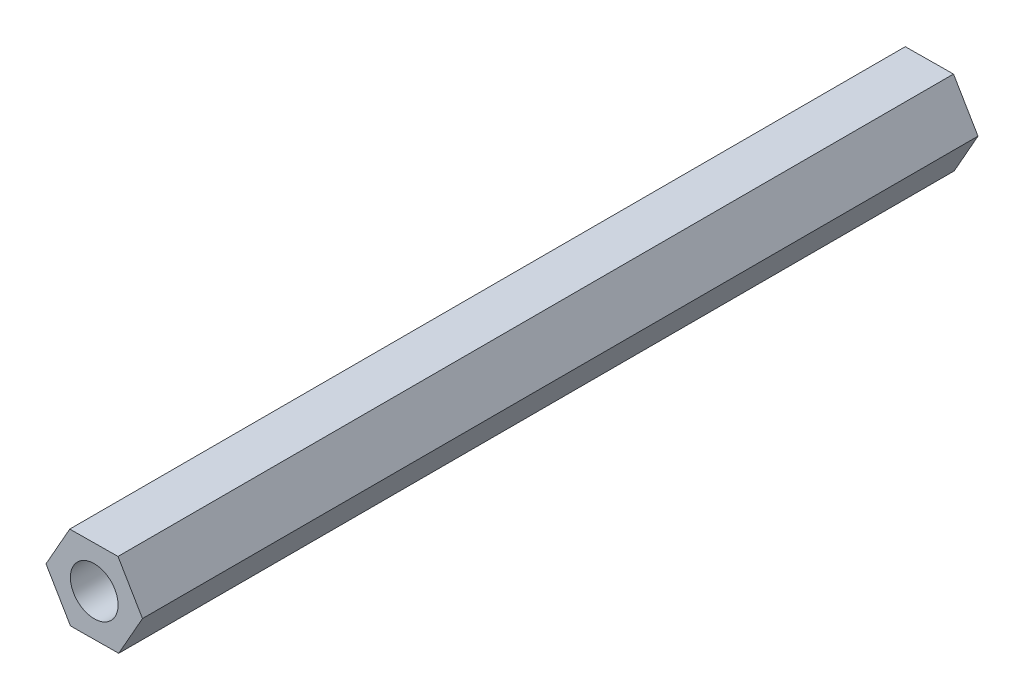
ISO-10303-21;
HEADER;
FILE_DESCRIPTION(('STEP AP214'),'2;1');
FILE_NAME('part.step','',(''),(''),'','','');
FILE_SCHEMA(('AUTOMOTIVE_DESIGN { 1 0 10303 214 1 1 1 1 }'));
ENDSEC;
DATA;
#1=APPLICATION_CONTEXT('core data for automotive mechanical design processes');
#2=APPLICATION_PROTOCOL_DEFINITION('international standard','automotive_design',2000,#1);
#3=PRODUCT_CONTEXT('',#1,'mechanical');
#4=PRODUCT('Part','Part','',(#3));
#5=PRODUCT_RELATED_PRODUCT_CATEGORY('part','',(#4));
#6=PRODUCT_DEFINITION_FORMATION('','',#4);
#7=PRODUCT_DEFINITION_CONTEXT('part definition',#1,'design');
#8=PRODUCT_DEFINITION('design','',#6,#7);
#9=PRODUCT_DEFINITION_SHAPE('','',#8);
#10=(LENGTH_UNIT() NAMED_UNIT(*) SI_UNIT(.MILLI.,.METRE.));
#11=(NAMED_UNIT(*) PLANE_ANGLE_UNIT() SI_UNIT($,.RADIAN.));
#12=(NAMED_UNIT(*) SI_UNIT($,.STERADIAN.) SOLID_ANGLE_UNIT());
#13=UNCERTAINTY_MEASURE_WITH_UNIT(LENGTH_MEASURE(1.E-05),#10,'distance_accuracy_value','');
#14=(GEOMETRIC_REPRESENTATION_CONTEXT(3) GLOBAL_UNCERTAINTY_ASSIGNED_CONTEXT((#13)) GLOBAL_UNIT_ASSIGNED_CONTEXT((#10,
#11,#12)) REPRESENTATION_CONTEXT('',''));
#15=CARTESIAN_POINT('',(0.,0.,0.));
#16=DIRECTION('',(0.,0.,1.));
#17=DIRECTION('',(1.,0.,0.));
#18=AXIS2_PLACEMENT_3D('',#15,#16,#17);
#19=CARTESIAN_POINT('',(0.,0.,70.));
#20=DIRECTION('',(0.,0.,1.));
#21=DIRECTION('',(1.,0.,0.));
#22=AXIS2_PLACEMENT_3D('',#19,#20,#21);
#23=PLANE('',#22);
#24=DIRECTION('',(0.999961257640527,0.00880245522430722,0.));
#25=VECTOR('',#24,1.);
#26=CARTESIAN_POINT('',(-1.98983906118775,-3.51765175136834,70.));
#27=LINE('',#26,#25);
#28=CARTESIAN_POINT('',(-1.98983906118775,-3.51765175136834,70.));
#29=VERTEX_POINT('',#28);
#30=CARTESIAN_POINT('',(2.05145624775792,-3.48207705211536,70.));
#31=VERTEX_POINT('',#30);
#32=EDGE_CURVE('E146',#29,#31,#27,.T.);
#33=ORIENTED_EDGE('',*,*,#32,.T.);
#34=DIRECTION('',(0.492357478980338,0.870393079529086,0.));
#35=VECTOR('',#34,1.);
#36=CARTESIAN_POINT('',(2.05145624775792,-3.48207705211536,70.));
#37=LINE('',#36,#35);
#38=CARTESIAN_POINT('',(4.04129530894568,0.0355746992529791,70.));
#39=VERTEX_POINT('',#38);
#40=EDGE_CURVE('E94',#31,#39,#37,.T.);
#41=ORIENTED_EDGE('',*,*,#40,.T.);
#42=DIRECTION('',(-0.507603778660189,0.861590624304779,0.));
#43=VECTOR('',#42,1.);
#44=CARTESIAN_POINT('',(4.04129530894568,0.0355746992529791,70.));
#45=LINE('',#44,#43);
#46=CARTESIAN_POINT('',(1.98983906118776,3.51765175136834,70.));
#47=VERTEX_POINT('',#46);
#48=EDGE_CURVE('E107',#39,#47,#45,.T.);
#49=ORIENTED_EDGE('',*,*,#48,.T.);
#50=DIRECTION('',(-0.999961257640527,-0.00880245522430723,0.));
#51=VECTOR('',#50,1.);
#52=CARTESIAN_POINT('',(1.98983906118776,3.51765175136834,70.));
#53=LINE('',#52,#51);
#54=CARTESIAN_POINT('',(-2.05145624775791,3.48207705211536,70.));
#55=VERTEX_POINT('',#54);
#56=EDGE_CURVE('E101',#47,#55,#53,.T.);
#57=ORIENTED_EDGE('',*,*,#56,.T.);
#58=DIRECTION('',(-0.492357478980338,-0.870393079529086,0.));
#59=VECTOR('',#58,1.);
#60=CARTESIAN_POINT('',(-2.05145624775791,3.48207705211536,70.));
#61=LINE('',#60,#59);
#62=CARTESIAN_POINT('',(-4.04129530894568,-0.0355746992529825,70.));
#63=VERTEX_POINT('',#62);
#64=EDGE_CURVE('E105',#55,#63,#61,.T.);
#65=ORIENTED_EDGE('',*,*,#64,.T.);
#66=DIRECTION('',(0.507603778660189,-0.861590624304779,0.));
#67=VECTOR('',#66,1.);
#68=CARTESIAN_POINT('',(-4.04129530894568,-0.0355746992529825,70.));
#69=LINE('',#68,#67);
#70=EDGE_CURVE('E57',#63,#29,#69,.T.);
#71=ORIENTED_EDGE('',*,*,#70,.T.);
#72=EDGE_LOOP('',(#33,#41,#49,#57,#65,#71));
#73=FACE_BOUND('',#72,.T.);
#74=CARTESIAN_POINT('',(0.,0.,70.));
#75=DIRECTION('',(0.,0.,1.));
#76=DIRECTION('',(1.,0.,0.));
#77=AXIS2_PLACEMENT_3D('',#74,#75,#76);
#78=CIRCLE('',#77,2.);
#79=CARTESIAN_POINT('',(2.,0.,70.));
#80=VERTEX_POINT('',#79);
#81=EDGE_CURVE('E134',#80,#80,#78,.T.);
#82=ORIENTED_EDGE('',*,*,#81,.F.);
#83=EDGE_LOOP('',(#82));
#84=FACE_BOUND('',#83,.T.);
#85=ADVANCED_FACE('F39',(#73,#84),#23,.T.);
#86=CARTESIAN_POINT('',(0.,0.,0.));
#87=DIRECTION('',(0.,0.,1.));
#88=DIRECTION('',(1.,0.,0.));
#89=AXIS2_PLACEMENT_3D('',#86,#87,#88);
#90=PLANE('',#89);
#91=DIRECTION('',(0.999961257640527,0.00880245522430722,0.));
#92=VECTOR('',#91,1.);
#93=CARTESIAN_POINT('',(-1.98983906118775,-3.51765175136834,0.));
#94=LINE('',#93,#92);
#95=CARTESIAN_POINT('',(-1.98983906118775,-3.51765175136834,0.));
#96=VERTEX_POINT('',#95);
#97=CARTESIAN_POINT('',(2.05145624775792,-3.48207705211536,0.));
#98=VERTEX_POINT('',#97);
#99=EDGE_CURVE('E129',#96,#98,#94,.T.);
#100=ORIENTED_EDGE('',*,*,#99,.F.);
#101=DIRECTION('',(0.507603778660189,-0.861590624304779,0.));
#102=VECTOR('',#101,1.);
#103=CARTESIAN_POINT('',(-4.04129530894568,-0.0355746992529825,0.));
#104=LINE('',#103,#102);
#105=CARTESIAN_POINT('',(-4.04129530894568,-0.0355746992529825,0.));
#106=VERTEX_POINT('',#105);
#107=EDGE_CURVE('E86',#106,#96,#104,.T.);
#108=ORIENTED_EDGE('',*,*,#107,.F.);
#109=DIRECTION('',(-0.492357478980338,-0.870393079529086,0.));
#110=VECTOR('',#109,1.);
#111=CARTESIAN_POINT('',(-2.05145624775791,3.48207705211536,0.));
#112=LINE('',#111,#110);
#113=CARTESIAN_POINT('',(-2.05145624775791,3.48207705211536,0.));
#114=VERTEX_POINT('',#113);
#115=EDGE_CURVE('E80',#114,#106,#112,.T.);
#116=ORIENTED_EDGE('',*,*,#115,.F.);
#117=DIRECTION('',(-0.999961257640527,-0.00880245522430723,0.));
#118=VECTOR('',#117,1.);
#119=CARTESIAN_POINT('',(1.98983906118776,3.51765175136834,0.));
#120=LINE('',#119,#118);
#121=CARTESIAN_POINT('',(1.98983906118776,3.51765175136834,0.));
#122=VERTEX_POINT('',#121);
#123=EDGE_CURVE('E116',#122,#114,#120,.T.);
#124=ORIENTED_EDGE('',*,*,#123,.F.);
#125=DIRECTION('',(-0.507603778660189,0.861590624304779,0.));
#126=VECTOR('',#125,1.);
#127=CARTESIAN_POINT('',(4.04129530894568,0.0355746992529791,0.));
#128=LINE('',#127,#126);
#129=CARTESIAN_POINT('',(4.04129530894568,0.0355746992529791,0.));
#130=VERTEX_POINT('',#129);
#131=EDGE_CURVE('E137',#130,#122,#128,.T.);
#132=ORIENTED_EDGE('',*,*,#131,.F.);
#133=DIRECTION('',(0.492357478980338,0.870393079529086,0.));
#134=VECTOR('',#133,1.);
#135=CARTESIAN_POINT('',(2.05145624775792,-3.48207705211536,0.));
#136=LINE('',#135,#134);
#137=EDGE_CURVE('E133',#98,#130,#136,.T.);
#138=ORIENTED_EDGE('',*,*,#137,.F.);
#139=EDGE_LOOP('',(#100,#108,#116,#124,#132,#138));
#140=FACE_BOUND('',#139,.T.);
#141=CARTESIAN_POINT('',(0.,0.,0.));
#142=DIRECTION('',(0.,0.,1.));
#143=DIRECTION('',(1.,0.,0.));
#144=AXIS2_PLACEMENT_3D('',#141,#142,#143);
#145=CIRCLE('',#144,2.);
#146=CARTESIAN_POINT('',(2.,0.,0.));
#147=VERTEX_POINT('',#146);
#148=EDGE_CURVE('E243',#147,#147,#145,.T.);
#149=ORIENTED_EDGE('',*,*,#148,.T.);
#150=EDGE_LOOP('',(#149));
#151=FACE_BOUND('',#150,.T.);
#152=ADVANCED_FACE('F159',(#140,#151),#90,.F.);
#153=CARTESIAN_POINT('',(-1.98983906118775,-3.51765175136834,70.));
#154=DIRECTION('',(-0.00880245522430722,0.999961257640527,0.));
#155=DIRECTION('',(-0.999961257640527,-0.00880245522430722,0.));
#156=AXIS2_PLACEMENT_3D('',#153,#154,#155);
#157=PLANE('',#156);
#158=ORIENTED_EDGE('',*,*,#99,.T.);
#159=DIRECTION('',(0.,0.,-1.));
#160=VECTOR('',#159,1.);
#161=CARTESIAN_POINT('',(2.05145624775792,-3.48207705211536,70.));
#162=LINE('',#161,#160);
#163=EDGE_CURVE('E11',#31,#98,#162,.T.);
#164=ORIENTED_EDGE('',*,*,#163,.F.);
#165=ORIENTED_EDGE('',*,*,#32,.F.);
#166=DIRECTION('',(0.,0.,-1.));
#167=VECTOR('',#166,1.);
#168=CARTESIAN_POINT('',(-1.98983906118775,-3.51765175136834,70.));
#169=LINE('',#168,#167);
#170=EDGE_CURVE('E125',#29,#96,#169,.T.);
#171=ORIENTED_EDGE('',*,*,#170,.T.);
#172=EDGE_LOOP('',(#158,#164,#165,#171));
#173=FACE_BOUND('',#172,.T.);
#174=ADVANCED_FACE('F41',(#173),#157,.F.);
#175=CARTESIAN_POINT('',(2.05145624775792,-3.48207705211536,70.));
#176=DIRECTION('',(-0.870393079529086,0.492357478980338,0.));
#177=DIRECTION('',(-0.492357478980338,-0.870393079529086,0.));
#178=AXIS2_PLACEMENT_3D('',#175,#176,#177);
#179=PLANE('',#178);
#180=ORIENTED_EDGE('',*,*,#137,.T.);
#181=DIRECTION('',(0.,0.,-1.));
#182=VECTOR('',#181,1.);
#183=CARTESIAN_POINT('',(4.04129530894568,0.0355746992529791,70.));
#184=LINE('',#183,#182);
#185=EDGE_CURVE('E49',#39,#130,#184,.T.);
#186=ORIENTED_EDGE('',*,*,#185,.F.);
#187=ORIENTED_EDGE('',*,*,#40,.F.);
#188=ORIENTED_EDGE('',*,*,#163,.T.);
#189=EDGE_LOOP('',(#180,#186,#187,#188));
#190=FACE_BOUND('',#189,.T.);
#191=ADVANCED_FACE('F184',(#190),#179,.F.);
#192=CARTESIAN_POINT('',(4.04129530894568,0.0355746992529791,70.));
#193=DIRECTION('',(-0.861590624304779,-0.507603778660189,0.));
#194=DIRECTION('',(0.507603778660189,-0.861590624304779,0.));
#195=AXIS2_PLACEMENT_3D('',#192,#193,#194);
#196=PLANE('',#195);
#197=ORIENTED_EDGE('',*,*,#131,.T.);
#198=DIRECTION('',(0.,0.,-1.));
#199=VECTOR('',#198,1.);
#200=CARTESIAN_POINT('',(1.98983906118776,3.51765175136834,70.));
#201=LINE('',#200,#199);
#202=EDGE_CURVE('E118',#47,#122,#201,.T.);
#203=ORIENTED_EDGE('',*,*,#202,.F.);
#204=ORIENTED_EDGE('',*,*,#48,.F.);
#205=ORIENTED_EDGE('',*,*,#185,.T.);
#206=EDGE_LOOP('',(#197,#203,#204,#205));
#207=FACE_BOUND('',#206,.T.);
#208=ADVANCED_FACE('F156',(#207),#196,.F.);
#209=CARTESIAN_POINT('',(1.98983906118776,3.51765175136834,70.));
#210=DIRECTION('',(0.00880245522430723,-0.999961257640527,0.));
#211=DIRECTION('',(0.999961257640527,0.00880245522430723,0.));
#212=AXIS2_PLACEMENT_3D('',#209,#210,#211);
#213=PLANE('',#212);
#214=ORIENTED_EDGE('',*,*,#123,.T.);
#215=DIRECTION('',(0.,0.,-1.));
#216=VECTOR('',#215,1.);
#217=CARTESIAN_POINT('',(-2.05145624775791,3.48207705211536,70.));
#218=LINE('',#217,#216);
#219=EDGE_CURVE('E113',#55,#114,#218,.T.);
#220=ORIENTED_EDGE('',*,*,#219,.F.);
#221=ORIENTED_EDGE('',*,*,#56,.F.);
#222=ORIENTED_EDGE('',*,*,#202,.T.);
#223=EDGE_LOOP('',(#214,#220,#221,#222));
#224=FACE_BOUND('',#223,.T.);
#225=ADVANCED_FACE('F114',(#224),#213,.F.);
#226=CARTESIAN_POINT('',(-2.05145624775791,3.48207705211536,70.));
#227=DIRECTION('',(0.870393079529086,-0.492357478980338,0.));
#228=DIRECTION('',(0.492357478980338,0.870393079529086,0.));
#229=AXIS2_PLACEMENT_3D('',#226,#227,#228);
#230=PLANE('',#229);
#231=ORIENTED_EDGE('',*,*,#115,.T.);
#232=DIRECTION('',(0.,0.,-1.));
#233=VECTOR('',#232,1.);
#234=CARTESIAN_POINT('',(-4.04129530894568,-0.0355746992529825,70.));
#235=LINE('',#234,#233);
#236=EDGE_CURVE('E119',#63,#106,#235,.T.);
#237=ORIENTED_EDGE('',*,*,#236,.F.);
#238=ORIENTED_EDGE('',*,*,#64,.F.);
#239=ORIENTED_EDGE('',*,*,#219,.T.);
#240=EDGE_LOOP('',(#231,#237,#238,#239));
#241=FACE_BOUND('',#240,.T.);
#242=ADVANCED_FACE('F121',(#241),#230,.F.);
#243=CARTESIAN_POINT('',(-4.04129530894568,-0.0355746992529825,70.));
#244=DIRECTION('',(0.861590624304779,0.507603778660189,0.));
#245=DIRECTION('',(-0.507603778660189,0.861590624304779,0.));
#246=AXIS2_PLACEMENT_3D('',#243,#244,#245);
#247=PLANE('',#246);
#248=ORIENTED_EDGE('',*,*,#107,.T.);
#249=ORIENTED_EDGE('',*,*,#170,.F.);
#250=ORIENTED_EDGE('',*,*,#70,.F.);
#251=ORIENTED_EDGE('',*,*,#236,.T.);
#252=EDGE_LOOP('',(#248,#249,#250,#251));
#253=FACE_BOUND('',#252,.T.);
#254=ADVANCED_FACE('F164',(#253),#247,.F.);
#255=CARTESIAN_POINT('',(0.,0.,70.));
#256=DIRECTION('',(0.,0.,-1.));
#257=DIRECTION('',(-1.,0.,0.));
#258=AXIS2_PLACEMENT_3D('',#255,#256,#257);
#259=CYLINDRICAL_SURFACE('',#258,2.);
#260=ORIENTED_EDGE('',*,*,#81,.T.);
#261=EDGE_LOOP('',(#260));
#262=FACE_BOUND('',#261,.T.);
#263=ORIENTED_EDGE('',*,*,#148,.F.);
#264=EDGE_LOOP('',(#263));
#265=FACE_BOUND('',#264,.T.);
#266=ADVANCED_FACE('F166',(#262,#265),#259,.F.);
#267=CLOSED_SHELL('',(#85,#152,#174,#191,#208,#225,#242,#254,#266));
#268=MANIFOLD_SOLID_BREP('B2',#267);
#269=ADVANCED_BREP_SHAPE_REPRESENTATION('',(#18,#268),#14);
#270=SHAPE_DEFINITION_REPRESENTATION(#9,#269);
ENDSEC;
END-ISO-10303-21;
